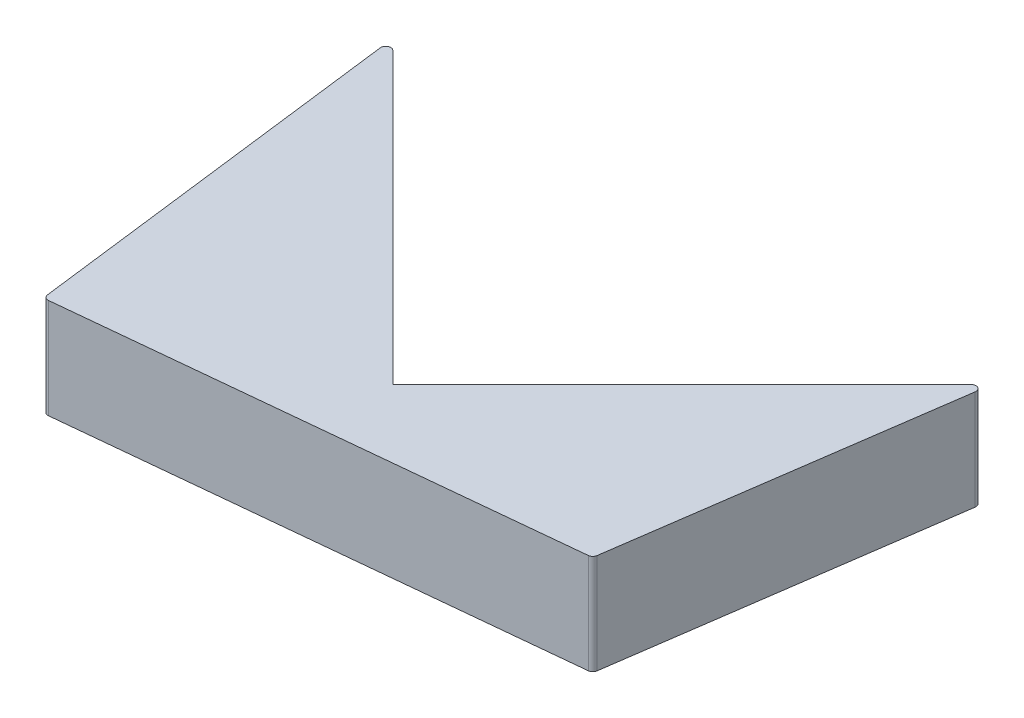
ISO-10303-21;
HEADER;
FILE_DESCRIPTION(('STEP AP214'),'2;1');
FILE_NAME('part.step','',(''),(''),'','','');
FILE_SCHEMA(('AUTOMOTIVE_DESIGN { 1 0 10303 214 1 1 1 1 }'));
ENDSEC;
DATA;
#1=APPLICATION_CONTEXT('core data for automotive mechanical design processes');
#2=APPLICATION_PROTOCOL_DEFINITION('international standard','automotive_design',2000,#1);
#3=PRODUCT_CONTEXT('',#1,'mechanical');
#4=PRODUCT('Part','Part','',(#3));
#5=PRODUCT_RELATED_PRODUCT_CATEGORY('part','',(#4));
#6=PRODUCT_DEFINITION_FORMATION('','',#4);
#7=PRODUCT_DEFINITION_CONTEXT('part definition',#1,'design');
#8=PRODUCT_DEFINITION('design','',#6,#7);
#9=PRODUCT_DEFINITION_SHAPE('','',#8);
#10=(LENGTH_UNIT() NAMED_UNIT(*) SI_UNIT(.MILLI.,.METRE.));
#11=(NAMED_UNIT(*) PLANE_ANGLE_UNIT() SI_UNIT($,.RADIAN.));
#12=(NAMED_UNIT(*) SI_UNIT($,.STERADIAN.) SOLID_ANGLE_UNIT());
#13=UNCERTAINTY_MEASURE_WITH_UNIT(LENGTH_MEASURE(1.E-05),#10,'distance_accuracy_value','');
#14=(GEOMETRIC_REPRESENTATION_CONTEXT(3) GLOBAL_UNCERTAINTY_ASSIGNED_CONTEXT((#13)) GLOBAL_UNIT_ASSIGNED_CONTEXT((#10,
#11,#12)) REPRESENTATION_CONTEXT('',''));
#15=CARTESIAN_POINT('',(0.,0.,0.));
#16=DIRECTION('',(0.,0.,1.));
#17=DIRECTION('',(1.,0.,0.));
#18=AXIS2_PLACEMENT_3D('',#15,#16,#17);
#19=CARTESIAN_POINT('',(-30.,10.,-30.));
#20=DIRECTION('',(-0.707106781186548,0.,0.707106781186548));
#21=DIRECTION('',(0.707106781186548,0.,0.707106781186548));
#22=AXIS2_PLACEMENT_3D('',#19,#20,#21);
#23=PLANE('',#22);
#24=DIRECTION('',(-0.707106781186547,0.,-0.707106781186547));
#25=VECTOR('',#24,1.);
#26=CARTESIAN_POINT('',(-30.,0.,-30.));
#27=LINE('',#26,#25);
#28=CARTESIAN_POINT('',(0.,0.,0.));
#29=VERTEX_POINT('',#28);
#30=CARTESIAN_POINT('',(-28.9695558015016,0.,-28.9695558015016));
#31=VERTEX_POINT('',#30);
#32=EDGE_CURVE('E149',#29,#31,#27,.T.);
#33=ORIENTED_EDGE('',*,*,#32,.T.);
#34=DIRECTION('',(0.,-1.,0.));
#35=VECTOR('',#34,1.);
#36=CARTESIAN_POINT('',(-28.9695558015016,10.,-28.9695558015016));
#37=LINE('',#36,#35);
#38=CARTESIAN_POINT('',(-28.9695558015016,10.,-28.9695558015016));
#39=VERTEX_POINT('',#38);
#40=EDGE_CURVE('E11',#31,#39,#37,.F.);
#41=ORIENTED_EDGE('',*,*,#40,.T.);
#42=DIRECTION('',(-0.707106781186547,0.,-0.707106781186547));
#43=VECTOR('',#42,1.);
#44=CARTESIAN_POINT('',(-30.,10.,-30.));
#45=LINE('',#44,#43);
#46=CARTESIAN_POINT('',(0.,10.,0.));
#47=VERTEX_POINT('',#46);
#48=EDGE_CURVE('E115',#47,#39,#45,.T.);
#49=ORIENTED_EDGE('',*,*,#48,.F.);
#50=DIRECTION('',(0.,-1.,0.));
#51=VECTOR('',#50,1.);
#52=CARTESIAN_POINT('',(0.,10.,0.));
#53=LINE('',#52,#51);
#54=EDGE_CURVE('E121',#47,#29,#53,.T.);
#55=ORIENTED_EDGE('',*,*,#54,.T.);
#56=EDGE_LOOP('',(#33,#41,#49,#55));
#57=FACE_BOUND('',#56,.T.);
#58=ADVANCED_FACE('F38',(#57),#23,.F.);
#59=CARTESIAN_POINT('',(-25.,10.,10.));
#60=DIRECTION('',(0.992277876713668,0.,-0.124034734589208));
#61=DIRECTION('',(-0.124034734589208,0.,-0.992277876713668));
#62=AXIS2_PLACEMENT_3D('',#59,#60,#61);
#63=PLANE('',#62);
#64=DIRECTION('',(0.124034734589208,0.,0.992277876713668));
#65=VECTOR('',#64,1.);
#66=CARTESIAN_POINT('',(-25.,10.,10.));
#67=LINE('',#66,#65);
#68=CARTESIAN_POINT('',(-29.8192481304517,10.,-28.5539850436137));
#69=VERTEX_POINT('',#68);
#70=CARTESIAN_POINT('',(-25.0605049762466,10.,9.51596019002754));
#71=VERTEX_POINT('',#70);
#72=EDGE_CURVE('E136',#69,#71,#67,.T.);
#73=ORIENTED_EDGE('',*,*,#72,.F.);
#74=DIRECTION('',(0.,-1.,0.));
#75=VECTOR('',#74,1.);
#76=CARTESIAN_POINT('',(-29.8192481304517,10.,-28.5539850436137));
#77=LINE('',#76,#75);
#78=CARTESIAN_POINT('',(-29.8192481304517,0.,-28.5539850436137));
#79=VERTEX_POINT('',#78);
#80=EDGE_CURVE('E47',#69,#79,#77,.T.);
#81=ORIENTED_EDGE('',*,*,#80,.T.);
#82=DIRECTION('',(0.124034734589208,0.,0.992277876713668));
#83=VECTOR('',#82,1.);
#84=CARTESIAN_POINT('',(-25.,0.,10.));
#85=LINE('',#84,#83);
#86=CARTESIAN_POINT('',(-25.0605049762466,0.,9.51596019002754));
#87=VERTEX_POINT('',#86);
#88=EDGE_CURVE('E152',#79,#87,#85,.T.);
#89=ORIENTED_EDGE('',*,*,#88,.T.);
#90=DIRECTION('',(0.,-1.,0.));
#91=VECTOR('',#90,1.);
#92=CARTESIAN_POINT('',(-25.0605049762466,10.,9.51596019002754));
#93=LINE('',#92,#91);
#94=EDGE_CURVE('E62',#87,#71,#93,.F.);
#95=ORIENTED_EDGE('',*,*,#94,.T.);
#96=EDGE_LOOP('',(#73,#81,#89,#95));
#97=FACE_BOUND('',#96,.T.);
#98=ADVANCED_FACE('F206',(#97),#63,.F.);
#99=CARTESIAN_POINT('',(25.,10.,5.));
#100=DIRECTION('',(-0.0995037190209989,0.,-0.995037190209989));
#101=DIRECTION('',(-0.995037190209989,0.,0.099503719020999));
#102=AXIS2_PLACEMENT_3D('',#99,#100,#101);
#103=PLANE('',#102);
#104=DIRECTION('',(0.995037190209989,0.,-0.0995037190209989));
#105=VECTOR('',#104,1.);
#106=CARTESIAN_POINT('',(25.,0.,5.));
#107=LINE('',#106,#105);
#108=CARTESIAN_POINT('',(-24.5146141783792,0.,9.95146141783792));
#109=VERTEX_POINT('',#108);
#110=CARTESIAN_POINT('',(24.6101808269197,0.,5.03898191730803));
#111=VERTEX_POINT('',#110);
#112=EDGE_CURVE('E155',#109,#111,#107,.T.);
#113=ORIENTED_EDGE('',*,*,#112,.T.);
#114=DIRECTION('',(0.,-1.,0.));
#115=VECTOR('',#114,1.);
#116=CARTESIAN_POINT('',(24.6101808269197,10.,5.03898191730803));
#117=LINE('',#116,#115);
#118=CARTESIAN_POINT('',(24.6101808269197,10.,5.03898191730803));
#119=VERTEX_POINT('',#118);
#120=EDGE_CURVE('E184',#111,#119,#117,.F.);
#121=ORIENTED_EDGE('',*,*,#120,.T.);
#122=DIRECTION('',(0.995037190209989,0.,-0.0995037190209989));
#123=VECTOR('',#122,1.);
#124=CARTESIAN_POINT('',(25.,10.,5.));
#125=LINE('',#124,#123);
#126=CARTESIAN_POINT('',(-24.5146141783792,10.,9.95146141783792));
#127=VERTEX_POINT('',#126);
#128=EDGE_CURVE('E140',#127,#119,#125,.T.);
#129=ORIENTED_EDGE('',*,*,#128,.F.);
#130=DIRECTION('',(0.,-1.,0.));
#131=VECTOR('',#130,1.);
#132=CARTESIAN_POINT('',(-24.5146141783792,10.,9.95146141783792));
#133=LINE('',#132,#131);
#134=EDGE_CURVE('E180',#127,#109,#133,.T.);
#135=ORIENTED_EDGE('',*,*,#134,.T.);
#136=EDGE_LOOP('',(#113,#121,#129,#135));
#137=FACE_BOUND('',#136,.T.);
#138=ADVANCED_FACE('F217',(#137),#103,.F.);
#139=CARTESIAN_POINT('',(30.,10.,-30.));
#140=DIRECTION('',(-0.989949493661167,0.,-0.141421356237309));
#141=DIRECTION('',(-0.141421356237309,0.,0.989949493661167));
#142=AXIS2_PLACEMENT_3D('',#139,#140,#141);
#143=PLANE('',#142);
#144=DIRECTION('',(0.141421356237309,0.,-0.989949493661167));
#145=VECTOR('',#144,1.);
#146=CARTESIAN_POINT('',(30.,10.,-30.));
#147=LINE('',#146,#145);
#148=CARTESIAN_POINT('',(25.0554037142398,10.,4.6121740003217));
#149=VERTEX_POINT('',#148);
#150=CARTESIAN_POINT('',(29.787867965644,10.,-28.5150757595083));
#151=VERTEX_POINT('',#150);
#152=EDGE_CURVE('E122',#149,#151,#147,.T.);
#153=ORIENTED_EDGE('',*,*,#152,.F.);
#154=DIRECTION('',(0.,-1.,0.));
#155=VECTOR('',#154,1.);
#156=CARTESIAN_POINT('',(25.0554037142398,10.,4.61217400032169));
#157=LINE('',#156,#155);
#158=CARTESIAN_POINT('',(25.0554037142398,0.,4.6121740003217));
#159=VERTEX_POINT('',#158);
#160=EDGE_CURVE('E164',#149,#159,#157,.T.);
#161=ORIENTED_EDGE('',*,*,#160,.T.);
#162=DIRECTION('',(0.141421356237309,0.,-0.989949493661167));
#163=VECTOR('',#162,1.);
#164=CARTESIAN_POINT('',(30.,0.,-30.));
#165=LINE('',#164,#163);
#166=CARTESIAN_POINT('',(29.787867965644,0.,-28.5150757595083));
#167=VERTEX_POINT('',#166);
#168=EDGE_CURVE('E142',#159,#167,#165,.T.);
#169=ORIENTED_EDGE('',*,*,#168,.T.);
#170=DIRECTION('',(0.,-1.,0.));
#171=VECTOR('',#170,1.);
#172=CARTESIAN_POINT('',(29.787867965644,10.,-28.5150757595083));
#173=LINE('',#172,#171);
#174=EDGE_CURVE('E132',#167,#151,#173,.F.);
#175=ORIENTED_EDGE('',*,*,#174,.T.);
#176=EDGE_LOOP('',(#153,#161,#169,#175));
#177=FACE_BOUND('',#176,.T.);
#178=ADVANCED_FACE('F225',(#177),#143,.F.);
#179=CARTESIAN_POINT('',(0.,10.,0.));
#180=DIRECTION('',(0.707106781186548,0.,0.707106781186547));
#181=DIRECTION('',(0.707106781186547,0.,-0.707106781186548));
#182=AXIS2_PLACEMENT_3D('',#179,#180,#181);
#183=PLANE('',#182);
#184=DIRECTION('',(-0.707106781186547,0.,0.707106781186547));
#185=VECTOR('',#184,1.);
#186=CARTESIAN_POINT('',(0.,10.,0.));
#187=LINE('',#186,#185);
#188=CARTESIAN_POINT('',(28.9393398282202,10.,-28.9393398282202));
#189=VERTEX_POINT('',#188);
#190=EDGE_CURVE('E110',#189,#47,#187,.T.);
#191=ORIENTED_EDGE('',*,*,#190,.F.);
#192=DIRECTION('',(0.,-1.,0.));
#193=VECTOR('',#192,1.);
#194=CARTESIAN_POINT('',(28.9393398282202,10.,-28.9393398282202));
#195=LINE('',#194,#193);
#196=CARTESIAN_POINT('',(28.9393398282202,0.,-28.9393398282202));
#197=VERTEX_POINT('',#196);
#198=EDGE_CURVE('E198',#189,#197,#195,.T.);
#199=ORIENTED_EDGE('',*,*,#198,.T.);
#200=DIRECTION('',(-0.707106781186547,0.,0.707106781186547));
#201=VECTOR('',#200,1.);
#202=CARTESIAN_POINT('',(0.,0.,0.));
#203=LINE('',#202,#201);
#204=EDGE_CURVE('E127',#197,#29,#203,.T.);
#205=ORIENTED_EDGE('',*,*,#204,.T.);
#206=ORIENTED_EDGE('',*,*,#54,.F.);
#207=EDGE_LOOP('',(#191,#199,#205,#206));
#208=FACE_BOUND('',#207,.T.);
#209=ADVANCED_FACE('F125',(#208),#183,.F.);
#210=CARTESIAN_POINT('',(0.,10.,0.));
#211=DIRECTION('',(0.,1.,0.));
#212=DIRECTION('',(0.,0.,1.));
#213=AXIS2_PLACEMENT_3D('',#210,#211,#212);
#214=PLANE('',#213);
#215=ORIENTED_EDGE('',*,*,#128,.T.);
#216=CARTESIAN_POINT('',(24.5604289674092,10.,4.54146332220303));
#217=DIRECTION('',(0.,1.,0.));
#218=DIRECTION('',(0.,0.,1.));
#219=AXIS2_PLACEMENT_3D('',#216,#217,#218);
#220=CIRCLE('',#219,0.5);
#221=EDGE_CURVE('E195',#119,#149,#220,.T.);
#222=ORIENTED_EDGE('',*,*,#221,.T.);
#223=ORIENTED_EDGE('',*,*,#152,.T.);
#224=CARTESIAN_POINT('',(29.2928932188135,10.,-28.5857864376269));
#225=DIRECTION('',(0.,1.,0.));
#226=DIRECTION('',(0.,0.,1.));
#227=AXIS2_PLACEMENT_3D('',#224,#225,#226);
#228=CIRCLE('',#227,0.5);
#229=EDGE_CURVE('E54',#151,#189,#228,.T.);
#230=ORIENTED_EDGE('',*,*,#229,.T.);
#231=ORIENTED_EDGE('',*,*,#190,.T.);
#232=ORIENTED_EDGE('',*,*,#48,.T.);
#233=CARTESIAN_POINT('',(-29.3231091920949,10.,-28.6160024109083));
#234=DIRECTION('',(0.,1.,0.));
#235=DIRECTION('',(0.,0.,1.));
#236=AXIS2_PLACEMENT_3D('',#233,#234,#235);
#237=CIRCLE('',#236,0.5);
#238=EDGE_CURVE('E190',#39,#69,#237,.T.);
#239=ORIENTED_EDGE('',*,*,#238,.T.);
#240=ORIENTED_EDGE('',*,*,#72,.T.);
#241=CARTESIAN_POINT('',(-24.5643660378897,10.,9.45394282273293));
#242=DIRECTION('',(0.,1.,0.));
#243=DIRECTION('',(0.,0.,1.));
#244=AXIS2_PLACEMENT_3D('',#241,#242,#243);
#245=CIRCLE('',#244,0.5);
#246=EDGE_CURVE('E187',#71,#127,#245,.T.);
#247=ORIENTED_EDGE('',*,*,#246,.T.);
#248=EDGE_LOOP('',(#215,#222,#223,#230,#231,#232,#239,#240,#247));
#249=FACE_BOUND('',#248,.T.);
#250=ADVANCED_FACE('F113',(#249),#214,.T.);
#251=CARTESIAN_POINT('',(0.,0.,0.));
#252=DIRECTION('',(0.,1.,0.));
#253=DIRECTION('',(0.,0.,1.));
#254=AXIS2_PLACEMENT_3D('',#251,#252,#253);
#255=PLANE('',#254);
#256=ORIENTED_EDGE('',*,*,#168,.F.);
#257=CARTESIAN_POINT('',(24.5604289674092,0.,4.54146332220303));
#258=DIRECTION('',(0.,1.,0.));
#259=DIRECTION('',(0.,0.,1.));
#260=AXIS2_PLACEMENT_3D('',#257,#258,#259);
#261=CIRCLE('',#260,0.5);
#262=EDGE_CURVE('E177',#159,#111,#261,.F.);
#263=ORIENTED_EDGE('',*,*,#262,.T.);
#264=ORIENTED_EDGE('',*,*,#112,.F.);
#265=CARTESIAN_POINT('',(-24.5643660378897,0.,9.45394282273293));
#266=DIRECTION('',(0.,1.,0.));
#267=DIRECTION('',(0.,0.,1.));
#268=AXIS2_PLACEMENT_3D('',#265,#266,#267);
#269=CIRCLE('',#268,0.5);
#270=EDGE_CURVE('E168',#109,#87,#269,.F.);
#271=ORIENTED_EDGE('',*,*,#270,.T.);
#272=ORIENTED_EDGE('',*,*,#88,.F.);
#273=CARTESIAN_POINT('',(-29.3231091920949,0.,-28.6160024109083));
#274=DIRECTION('',(0.,1.,0.));
#275=DIRECTION('',(0.,0.,1.));
#276=AXIS2_PLACEMENT_3D('',#273,#274,#275);
#277=CIRCLE('',#276,0.5);
#278=EDGE_CURVE('E171',#79,#31,#277,.F.);
#279=ORIENTED_EDGE('',*,*,#278,.T.);
#280=ORIENTED_EDGE('',*,*,#32,.F.);
#281=ORIENTED_EDGE('',*,*,#204,.F.);
#282=CARTESIAN_POINT('',(29.2928932188135,0.,-28.5857864376269));
#283=DIRECTION('',(0.,1.,0.));
#284=DIRECTION('',(0.,0.,1.));
#285=AXIS2_PLACEMENT_3D('',#282,#283,#284);
#286=CIRCLE('',#285,0.5);
#287=EDGE_CURVE('E174',#197,#167,#286,.F.);
#288=ORIENTED_EDGE('',*,*,#287,.T.);
#289=EDGE_LOOP('',(#256,#263,#264,#271,#272,#279,#280,#281,#288));
#290=FACE_BOUND('',#289,.T.);
#291=ADVANCED_FACE('F210',(#290),#255,.F.);
#292=CARTESIAN_POINT('',(24.5604289674092,10.,4.54146332220303));
#293=DIRECTION('',(0.,-1.,0.));
#294=DIRECTION('',(0.,0.,-1.));
#295=AXIS2_PLACEMENT_3D('',#292,#293,#294);
#296=CYLINDRICAL_SURFACE('',#295,0.5);
#297=ORIENTED_EDGE('',*,*,#221,.F.);
#298=ORIENTED_EDGE('',*,*,#120,.F.);
#299=ORIENTED_EDGE('',*,*,#262,.F.);
#300=ORIENTED_EDGE('',*,*,#160,.F.);
#301=EDGE_LOOP('',(#297,#298,#299,#300));
#302=FACE_BOUND('',#301,.T.);
#303=ADVANCED_FACE('F223',(#302),#296,.T.);
#304=CARTESIAN_POINT('',(29.2928932188135,10.,-28.5857864376269));
#305=DIRECTION('',(0.,-1.,0.));
#306=DIRECTION('',(0.,0.,-1.));
#307=AXIS2_PLACEMENT_3D('',#304,#305,#306);
#308=CYLINDRICAL_SURFACE('',#307,0.5);
#309=ORIENTED_EDGE('',*,*,#229,.F.);
#310=ORIENTED_EDGE('',*,*,#174,.F.);
#311=ORIENTED_EDGE('',*,*,#287,.F.);
#312=ORIENTED_EDGE('',*,*,#198,.F.);
#313=EDGE_LOOP('',(#309,#310,#311,#312));
#314=FACE_BOUND('',#313,.T.);
#315=ADVANCED_FACE('F228',(#314),#308,.T.);
#316=CARTESIAN_POINT('',(-29.3231091920949,10.,-28.6160024109083));
#317=DIRECTION('',(0.,-1.,0.));
#318=DIRECTION('',(0.,0.,-1.));
#319=AXIS2_PLACEMENT_3D('',#316,#317,#318);
#320=CYLINDRICAL_SURFACE('',#319,0.5);
#321=ORIENTED_EDGE('',*,*,#238,.F.);
#322=ORIENTED_EDGE('',*,*,#40,.F.);
#323=ORIENTED_EDGE('',*,*,#278,.F.);
#324=ORIENTED_EDGE('',*,*,#80,.F.);
#325=EDGE_LOOP('',(#321,#322,#323,#324));
#326=FACE_BOUND('',#325,.T.);
#327=ADVANCED_FACE('F230',(#326),#320,.T.);
#328=CARTESIAN_POINT('',(-24.5643660378897,10.,9.45394282273293));
#329=DIRECTION('',(0.,-1.,0.));
#330=DIRECTION('',(0.,0.,-1.));
#331=AXIS2_PLACEMENT_3D('',#328,#329,#330);
#332=CYLINDRICAL_SURFACE('',#331,0.5);
#333=ORIENTED_EDGE('',*,*,#246,.F.);
#334=ORIENTED_EDGE('',*,*,#94,.F.);
#335=ORIENTED_EDGE('',*,*,#270,.F.);
#336=ORIENTED_EDGE('',*,*,#134,.F.);
#337=EDGE_LOOP('',(#333,#334,#335,#336));
#338=FACE_BOUND('',#337,.T.);
#339=ADVANCED_FACE('F40',(#338),#332,.T.);
#340=CLOSED_SHELL('',(#58,#98,#138,#178,#209,#250,#291,#303,#315,#327,#339));
#341=MANIFOLD_SOLID_BREP('B2',#340);
#342=ADVANCED_BREP_SHAPE_REPRESENTATION('',(#18,#341),#14);
#343=SHAPE_DEFINITION_REPRESENTATION(#9,#342);
ENDSEC;
END-ISO-10303-21;
